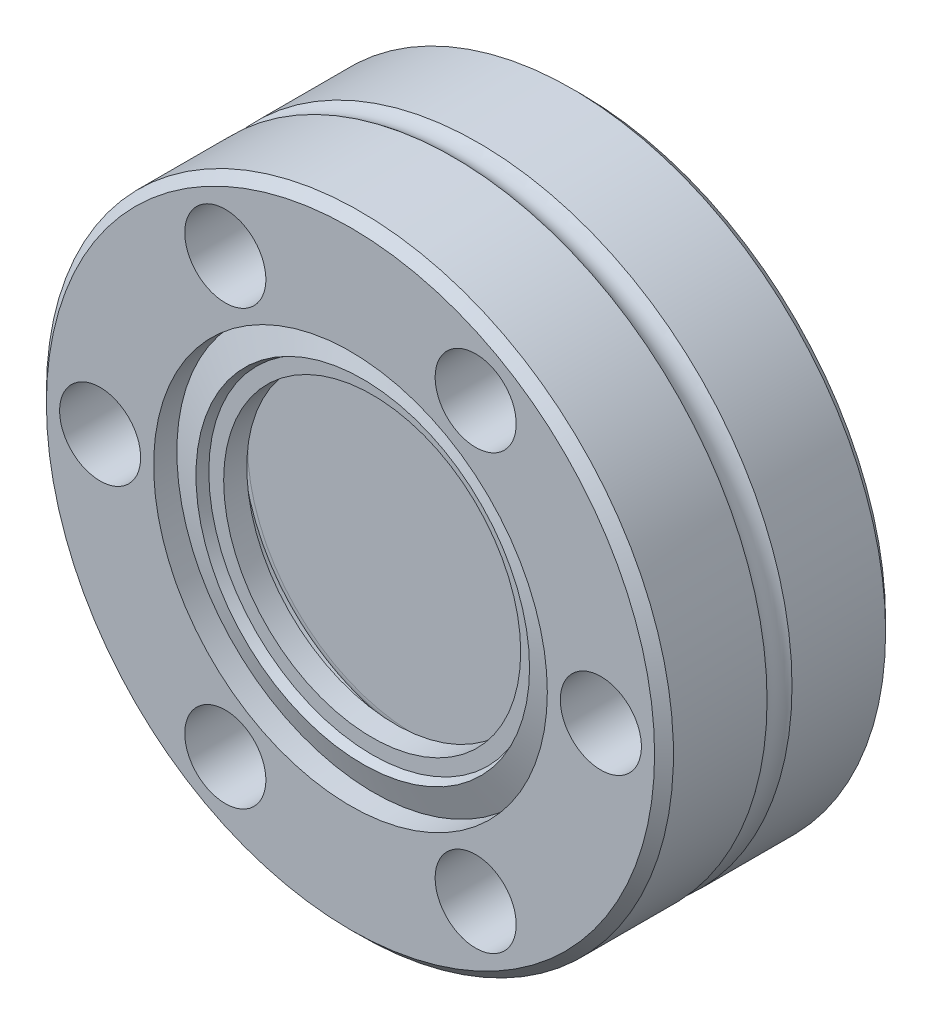
ISO-10303-21;
HEADER;
FILE_DESCRIPTION(('STEP AP214'),'2;1');
FILE_NAME('part.step','',(''),(''),'','','');
FILE_SCHEMA(('AUTOMOTIVE_DESIGN { 1 0 10303 214 1 1 1 1 }'));
ENDSEC;
DATA;
#1=APPLICATION_CONTEXT('core data for automotive mechanical design processes');
#2=APPLICATION_PROTOCOL_DEFINITION('international standard','automotive_design',2000,#1);
#3=PRODUCT_CONTEXT('',#1,'mechanical');
#4=PRODUCT('Part','Part','',(#3));
#5=PRODUCT_RELATED_PRODUCT_CATEGORY('part','',(#4));
#6=PRODUCT_DEFINITION_FORMATION('','',#4);
#7=PRODUCT_DEFINITION_CONTEXT('part definition',#1,'design');
#8=PRODUCT_DEFINITION('design','',#6,#7);
#9=PRODUCT_DEFINITION_SHAPE('','',#8);
#10=(LENGTH_UNIT() NAMED_UNIT(*) SI_UNIT(.MILLI.,.METRE.));
#11=(NAMED_UNIT(*) PLANE_ANGLE_UNIT() SI_UNIT($,.RADIAN.));
#12=(NAMED_UNIT(*) SI_UNIT($,.STERADIAN.) SOLID_ANGLE_UNIT());
#13=UNCERTAINTY_MEASURE_WITH_UNIT(LENGTH_MEASURE(1.E-05),#10,'distance_accuracy_value','');
#14=(GEOMETRIC_REPRESENTATION_CONTEXT(3) GLOBAL_UNCERTAINTY_ASSIGNED_CONTEXT((#13)) GLOBAL_UNIT_ASSIGNED_CONTEXT((#10,
#11,#12)) REPRESENTATION_CONTEXT('',''));
#15=CARTESIAN_POINT('',(0.,0.,0.));
#16=DIRECTION('',(0.,0.,1.));
#17=DIRECTION('',(1.,0.,0.));
#18=AXIS2_PLACEMENT_3D('',#15,#16,#17);
#19=CARTESIAN_POINT('',(0.,0.,8.3058));
#20=DIRECTION('',(0.,0.,-1.));
#21=DIRECTION('',(-1.,0.,0.));
#22=AXIS2_PLACEMENT_3D('',#19,#20,#21);
#23=TOROIDAL_SURFACE('',#22,9.0551,0.635);
#24=CARTESIAN_POINT('',(0.,0.,8.3058));
#25=DIRECTION('',(0.,0.,1.));
#26=DIRECTION('',(1.,0.,0.));
#27=AXIS2_PLACEMENT_3D('',#24,#25,#26);
#28=CIRCLE('',#27,9.6901);
#29=CARTESIAN_POINT('',(9.6901,0.,8.3058));
#30=VERTEX_POINT('',#29);
#31=EDGE_CURVE('E301',#30,#30,#28,.T.);
#32=ORIENTED_EDGE('',*,*,#31,.T.);
#33=EDGE_LOOP('',(#32));
#34=FACE_BOUND('',#33,.T.);
#35=CARTESIAN_POINT('',(0.,0.,8.9408));
#36=DIRECTION('',(0.,0.,-1.));
#37=DIRECTION('',(-1.,0.,0.));
#38=AXIS2_PLACEMENT_3D('',#35,#36,#37);
#39=CIRCLE('',#38,9.0551);
#40=CARTESIAN_POINT('',(-9.0551,0.,8.9408));
#41=VERTEX_POINT('',#40);
#42=EDGE_CURVE('E10',#41,#41,#39,.T.);
#43=ORIENTED_EDGE('',*,*,#42,.T.);
#44=EDGE_LOOP('',(#43));
#45=FACE_BOUND('',#44,.T.);
#46=ADVANCED_FACE('F16',(#34,#45),#23,.T.);
#47=CARTESIAN_POINT('',(-9.0551,0.,8.9408));
#48=DIRECTION('',(0.,0.,-1.));
#49=DIRECTION('',(0.,-1.,0.));
#50=AXIS2_PLACEMENT_3D('',#47,#48,#49);
#51=PLANE('',#50);
#52=ORIENTED_EDGE('',*,*,#42,.F.);
#53=EDGE_LOOP('',(#52));
#54=FACE_BOUND('',#53,.T.);
#55=ADVANCED_FACE('F360',(#54),#51,.F.);
#56=CARTESIAN_POINT('',(0.,0.,54.9906));
#57=DIRECTION('',(0.,0.,1.));
#58=DIRECTION('',(-1.,0.,0.));
#59=AXIS2_PLACEMENT_3D('',#56,#57,#58);
#60=CYLINDRICAL_SURFACE('',#59,9.1313);
#61=CARTESIAN_POINT('',(0.,0.,8.4328));
#62=DIRECTION('',(0.,0.,-1.));
#63=DIRECTION('',(-1.,0.,0.));
#64=AXIS2_PLACEMENT_3D('',#61,#62,#63);
#65=CIRCLE('',#64,9.1313);
#66=CARTESIAN_POINT('',(-9.1313,0.,8.4328));
#67=VERTEX_POINT('',#66);
#68=EDGE_CURVE('E24',#67,#67,#65,.T.);
#69=ORIENTED_EDGE('',*,*,#68,.F.);
#70=EDGE_LOOP('',(#69));
#71=FACE_BOUND('',#70,.T.);
#72=CARTESIAN_POINT('',(0.,0.,0.9906));
#73=DIRECTION('',(0.,0.,-1.));
#74=DIRECTION('',(-1.,0.,0.));
#75=AXIS2_PLACEMENT_3D('',#72,#73,#74);
#76=CIRCLE('',#75,9.1313);
#77=CARTESIAN_POINT('',(-9.1313,0.,0.9906));
#78=VERTEX_POINT('',#77);
#79=EDGE_CURVE('E237',#78,#78,#76,.T.);
#80=ORIENTED_EDGE('',*,*,#79,.T.);
#81=EDGE_LOOP('',(#80));
#82=FACE_BOUND('',#81,.T.);
#83=ADVANCED_FACE('F365',(#71,#82),#60,.F.);
#84=CARTESIAN_POINT('',(-8.39011573823687,0.,8.4328));
#85=DIRECTION('',(0.,0.,1.));
#86=DIRECTION('',(1.,0.,0.));
#87=AXIS2_PLACEMENT_3D('',#84,#85,#86);
#88=PLANE('',#87);
#89=ORIENTED_EDGE('',*,*,#68,.T.);
#90=EDGE_LOOP('',(#89));
#91=FACE_BOUND('',#90,.T.);
#92=ADVANCED_FACE('F384',(#91),#88,.F.);
#93=CARTESIAN_POINT('',(0.,0.,0.9906));
#94=DIRECTION('',(0.,0.,1.));
#95=DIRECTION('',(1.,0.,0.));
#96=AXIS2_PLACEMENT_3D('',#93,#94,#95);
#97=PLANE('',#96);
#98=ORIENTED_EDGE('',*,*,#79,.F.);
#99=EDGE_LOOP('',(#98));
#100=FACE_BOUND('',#99,.T.);
#101=CARTESIAN_POINT('',(0.,0.,0.9906));
#102=DIRECTION('',(0.,0.,1.));
#103=DIRECTION('',(0.,1.,0.));
#104=AXIS2_PLACEMENT_3D('',#101,#102,#103);
#105=CIRCLE('',#104,10.8077);
#106=CARTESIAN_POINT('',(0.,10.8077,0.9906));
#107=VERTEX_POINT('',#106);
#108=EDGE_CURVE('E209',#107,#107,#105,.T.);
#109=ORIENTED_EDGE('',*,*,#108,.F.);
#110=EDGE_LOOP('',(#109));
#111=FACE_BOUND('',#110,.T.);
#112=ADVANCED_FACE('F330',(#100,#111),#97,.F.);
#113=CARTESIAN_POINT('',(0.,0.,0.));
#114=DIRECTION('',(0.,0.,1.));
#115=DIRECTION('',(1.,0.,0.));
#116=AXIS2_PLACEMENT_3D('',#113,#114,#115);
#117=PLANE('',#116);
#118=CARTESIAN_POINT('',(0.,0.,0.));
#119=DIRECTION('',(0.,0.,1.));
#120=DIRECTION('',(1.,0.,0.));
#121=AXIS2_PLACEMENT_3D('',#118,#119,#120);
#122=CIRCLE('',#121,16.383);
#123=CARTESIAN_POINT('',(16.383,0.,0.));
#124=VERTEX_POINT('',#123);
#125=EDGE_CURVE('E234',#124,#124,#122,.T.);
#126=ORIENTED_EDGE('',*,*,#125,.F.);
#127=EDGE_LOOP('',(#126));
#128=FACE_BOUND('',#127,.T.);
#129=CARTESIAN_POINT('',(6.7437,11.6804310310022,0.));
#130=DIRECTION('',(0.,0.,-1.));
#131=DIRECTION('',(0.5,0.866025403784439,0.));
#132=AXIS2_PLACEMENT_3D('',#129,#130,#131);
#133=CIRCLE('',#132,2.1844);
#134=CARTESIAN_POINT('',(7.8359,13.5721769230289,0.));
#135=VERTEX_POINT('',#134);
#136=EDGE_CURVE('E223',#135,#135,#133,.T.);
#137=ORIENTED_EDGE('',*,*,#136,.F.);
#138=EDGE_LOOP('',(#137));
#139=FACE_BOUND('',#138,.T.);
#140=CARTESIAN_POINT('',(-6.7437,11.6804310310022,0.));
#141=DIRECTION('',(0.,0.,-1.));
#142=DIRECTION('',(-0.5,0.866025403784439,0.));
#143=AXIS2_PLACEMENT_3D('',#140,#141,#142);
#144=CIRCLE('',#143,2.1844);
#145=CARTESIAN_POINT('',(-7.8359,13.5721769230289,0.));
#146=VERTEX_POINT('',#145);
#147=EDGE_CURVE('E212',#146,#146,#144,.T.);
#148=ORIENTED_EDGE('',*,*,#147,.F.);
#149=EDGE_LOOP('',(#148));
#150=FACE_BOUND('',#149,.T.);
#151=CARTESIAN_POINT('',(-13.4874,0.,0.));
#152=DIRECTION('',(0.,0.,-1.));
#153=DIRECTION('',(-1.,0.,0.));
#154=AXIS2_PLACEMENT_3D('',#151,#152,#153);
#155=CIRCLE('',#154,2.1844);
#156=CARTESIAN_POINT('',(-15.6718,0.,0.));
#157=VERTEX_POINT('',#156);
#158=EDGE_CURVE('E185',#157,#157,#155,.T.);
#159=ORIENTED_EDGE('',*,*,#158,.F.);
#160=EDGE_LOOP('',(#159));
#161=FACE_BOUND('',#160,.T.);
#162=CARTESIAN_POINT('',(-6.7437,-11.6804310310022,0.));
#163=DIRECTION('',(0.,0.,-1.));
#164=DIRECTION('',(-0.5,-0.866025403784439,0.));
#165=AXIS2_PLACEMENT_3D('',#162,#163,#164);
#166=CIRCLE('',#165,2.1844);
#167=CARTESIAN_POINT('',(-7.8359,-13.5721769230289,0.));
#168=VERTEX_POINT('',#167);
#169=EDGE_CURVE('E184',#168,#168,#166,.T.);
#170=ORIENTED_EDGE('',*,*,#169,.F.);
#171=EDGE_LOOP('',(#170));
#172=FACE_BOUND('',#171,.T.);
#173=CARTESIAN_POINT('',(6.7437,-11.6804310310022,0.));
#174=DIRECTION('',(0.,0.,-1.));
#175=DIRECTION('',(0.5,-0.866025403784439,0.));
#176=AXIS2_PLACEMENT_3D('',#173,#174,#175);
#177=CIRCLE('',#176,2.1844);
#178=CARTESIAN_POINT('',(7.8359,-13.5721769230289,0.));
#179=VERTEX_POINT('',#178);
#180=EDGE_CURVE('E163',#179,#179,#177,.T.);
#181=ORIENTED_EDGE('',*,*,#180,.F.);
#182=EDGE_LOOP('',(#181));
#183=FACE_BOUND('',#182,.T.);
#184=CARTESIAN_POINT('',(13.4874,0.,0.));
#185=DIRECTION('',(0.,0.,-1.));
#186=DIRECTION('',(1.,0.,0.));
#187=AXIS2_PLACEMENT_3D('',#184,#185,#186);
#188=CIRCLE('',#187,2.1844);
#189=CARTESIAN_POINT('',(15.6718,0.,0.));
#190=VERTEX_POINT('',#189);
#191=EDGE_CURVE('E162',#190,#190,#188,.T.);
#192=ORIENTED_EDGE('',*,*,#191,.F.);
#193=EDGE_LOOP('',(#192));
#194=FACE_BOUND('',#193,.T.);
#195=CARTESIAN_POINT('',(0.,0.,0.));
#196=DIRECTION('',(0.,0.,1.));
#197=DIRECTION('',(0.,1.,0.));
#198=AXIS2_PLACEMENT_3D('',#195,#196,#197);
#199=CIRCLE('',#198,10.8077);
#200=CARTESIAN_POINT('',(0.,10.8077,0.));
#201=VERTEX_POINT('',#200);
#202=EDGE_CURVE('E213',#201,#201,#199,.T.);
#203=ORIENTED_EDGE('',*,*,#202,.T.);
#204=EDGE_LOOP('',(#203));
#205=FACE_BOUND('',#204,.T.);
#206=ADVANCED_FACE('F326',(#128,#139,#150,#161,#172,#183,#194,#205),#117,.F.);
#207=CARTESIAN_POINT('',(0.,0.,0.508000000000008));
#208=DIRECTION('',(0.,0.,1.));
#209=DIRECTION('',(1.,0.,0.));
#210=AXIS2_PLACEMENT_3D('',#207,#208,#209);
#211=CONICAL_SURFACE('',#210,16.891,0.785398163397442);
#212=ORIENTED_EDGE('',*,*,#125,.T.);
#213=EDGE_LOOP('',(#212));
#214=FACE_BOUND('',#213,.T.);
#215=CARTESIAN_POINT('',(0.,0.,0.508000000000008));
#216=DIRECTION('',(0.,0.,1.));
#217=DIRECTION('',(1.,0.,0.));
#218=AXIS2_PLACEMENT_3D('',#215,#216,#217);
#219=CIRCLE('',#218,16.891);
#220=CARTESIAN_POINT('',(16.891,0.,0.508000000000008));
#221=VERTEX_POINT('',#220);
#222=EDGE_CURVE('E180',#221,#221,#219,.T.);
#223=ORIENTED_EDGE('',*,*,#222,.F.);
#224=EDGE_LOOP('',(#223));
#225=FACE_BOUND('',#224,.T.);
#226=ADVANCED_FACE('F329',(#214,#225),#211,.T.);
#227=CARTESIAN_POINT('',(0.,0.,12.446));
#228=DIRECTION('',(0.,0.,-1.));
#229=DIRECTION('',(-1.,0.,0.));
#230=AXIS2_PLACEMENT_3D('',#227,#228,#229);
#231=CONICAL_SURFACE('',#230,16.383,0.785398163397455);
#232=CARTESIAN_POINT('',(0.,0.,11.938));
#233=DIRECTION('',(0.,0.,-1.));
#234=DIRECTION('',(-1.,0.,0.));
#235=AXIS2_PLACEMENT_3D('',#232,#233,#234);
#236=CIRCLE('',#235,16.891);
#237=CARTESIAN_POINT('',(-16.891,0.,11.938));
#238=VERTEX_POINT('',#237);
#239=EDGE_CURVE('E198',#238,#238,#236,.T.);
#240=ORIENTED_EDGE('',*,*,#239,.F.);
#241=EDGE_LOOP('',(#240));
#242=FACE_BOUND('',#241,.T.);
#243=CARTESIAN_POINT('',(0.,0.,12.446));
#244=DIRECTION('',(0.,0.,-1.));
#245=DIRECTION('',(-1.,0.,0.));
#246=AXIS2_PLACEMENT_3D('',#243,#244,#245);
#247=CIRCLE('',#246,16.383);
#248=CARTESIAN_POINT('',(-16.383,0.,12.446));
#249=VERTEX_POINT('',#248);
#250=EDGE_CURVE('E181',#249,#249,#247,.T.);
#251=ORIENTED_EDGE('',*,*,#250,.T.);
#252=EDGE_LOOP('',(#251));
#253=FACE_BOUND('',#252,.T.);
#254=ADVANCED_FACE('F435',(#242,#253),#231,.T.);
#255=CARTESIAN_POINT('',(0.,0.,6.223));
#256=DIRECTION('',(0.,0.,1.));
#257=DIRECTION('',(1.,0.,0.));
#258=AXIS2_PLACEMENT_3D('',#255,#256,#257);
#259=TOROIDAL_SURFACE('',#258,17.653,1.016);
#260=CARTESIAN_POINT('',(0.,0.,6.89502083301041));
#261=DIRECTION('',(0.,0.,-1.));
#262=DIRECTION('',(-1.,0.,0.));
#263=AXIS2_PLACEMENT_3D('',#260,#261,#262);
#264=CIRCLE('',#263,16.891);
#265=CARTESIAN_POINT('',(-16.891,0.,6.89502083301041));
#266=VERTEX_POINT('',#265);
#267=EDGE_CURVE('E195',#266,#266,#264,.T.);
#268=ORIENTED_EDGE('',*,*,#267,.T.);
#269=EDGE_LOOP('',(#268));
#270=FACE_BOUND('',#269,.T.);
#271=CARTESIAN_POINT('',(0.,0.,5.55097916698959));
#272=DIRECTION('',(0.,0.,1.));
#273=DIRECTION('',(1.,0.,0.));
#274=AXIS2_PLACEMENT_3D('',#271,#272,#273);
#275=CIRCLE('',#274,16.891);
#276=CARTESIAN_POINT('',(16.891,0.,5.55097916698959));
#277=VERTEX_POINT('',#276);
#278=EDGE_CURVE('E177',#277,#277,#275,.T.);
#279=ORIENTED_EDGE('',*,*,#278,.T.);
#280=EDGE_LOOP('',(#279));
#281=FACE_BOUND('',#280,.T.);
#282=ADVANCED_FACE('F431',(#270,#281),#259,.F.);
#283=CARTESIAN_POINT('',(0.,0.,137.16));
#284=DIRECTION('',(0.,0.,-1.));
#285=DIRECTION('',(1.,0.,0.));
#286=AXIS2_PLACEMENT_3D('',#283,#284,#285);
#287=CYLINDRICAL_SURFACE('',#286,16.891);
#288=ORIENTED_EDGE('',*,*,#222,.T.);
#289=EDGE_LOOP('',(#288));
#290=FACE_BOUND('',#289,.T.);
#291=ORIENTED_EDGE('',*,*,#278,.F.);
#292=EDGE_LOOP('',(#291));
#293=FACE_BOUND('',#292,.T.);
#294=ADVANCED_FACE('F396',(#290,#293),#287,.T.);
#295=CARTESIAN_POINT('',(16.891,0.,12.446));
#296=DIRECTION('',(0.,0.,-1.));
#297=DIRECTION('',(0.,-1.,0.));
#298=AXIS2_PLACEMENT_3D('',#295,#296,#297);
#299=PLANE('',#298);
#300=ORIENTED_EDGE('',*,*,#250,.F.);
#301=EDGE_LOOP('',(#300));
#302=FACE_BOUND('',#301,.T.);
#303=CARTESIAN_POINT('',(6.7437,11.6804310310022,12.446));
#304=DIRECTION('',(0.,0.,-1.));
#305=DIRECTION('',(-1.,0.,0.));
#306=AXIS2_PLACEMENT_3D('',#303,#304,#305);
#307=CIRCLE('',#306,2.1844);
#308=CARTESIAN_POINT('',(4.5593,11.6804310310022,12.446));
#309=VERTEX_POINT('',#308);
#310=EDGE_CURVE('E199',#309,#309,#307,.T.);
#311=ORIENTED_EDGE('',*,*,#310,.T.);
#312=EDGE_LOOP('',(#311));
#313=FACE_BOUND('',#312,.T.);
#314=CARTESIAN_POINT('',(-6.7437,11.6804310310022,12.446));
#315=DIRECTION('',(0.,0.,-1.));
#316=DIRECTION('',(-1.,0.,0.));
#317=AXIS2_PLACEMENT_3D('',#314,#315,#316);
#318=CIRCLE('',#317,2.1844);
#319=CARTESIAN_POINT('',(-8.9281,11.6804310310022,12.446));
#320=VERTEX_POINT('',#319);
#321=EDGE_CURVE('E220',#320,#320,#318,.T.);
#322=ORIENTED_EDGE('',*,*,#321,.T.);
#323=EDGE_LOOP('',(#322));
#324=FACE_BOUND('',#323,.T.);
#325=CARTESIAN_POINT('',(-13.4874,0.,12.446));
#326=DIRECTION('',(0.,0.,-1.));
#327=DIRECTION('',(-1.,0.,0.));
#328=AXIS2_PLACEMENT_3D('',#325,#326,#327);
#329=CIRCLE('',#328,2.1844);
#330=CARTESIAN_POINT('',(-15.6718,0.,12.446));
#331=VERTEX_POINT('',#330);
#332=EDGE_CURVE('E188',#331,#331,#329,.T.);
#333=ORIENTED_EDGE('',*,*,#332,.T.);
#334=EDGE_LOOP('',(#333));
#335=FACE_BOUND('',#334,.T.);
#336=CARTESIAN_POINT('',(-6.7437,-11.6804310310022,12.446));
#337=DIRECTION('',(0.,0.,-1.));
#338=DIRECTION('',(-1.,0.,0.));
#339=AXIS2_PLACEMENT_3D('',#336,#337,#338);
#340=CIRCLE('',#339,2.1844);
#341=CARTESIAN_POINT('',(-8.9281,-11.6804310310022,12.446));
#342=VERTEX_POINT('',#341);
#343=EDGE_CURVE('E171',#342,#342,#340,.T.);
#344=ORIENTED_EDGE('',*,*,#343,.T.);
#345=EDGE_LOOP('',(#344));
#346=FACE_BOUND('',#345,.T.);
#347=CARTESIAN_POINT('',(6.7437,-11.6804310310022,12.446));
#348=DIRECTION('',(0.,0.,-1.));
#349=DIRECTION('',(-1.,0.,0.));
#350=AXIS2_PLACEMENT_3D('',#347,#348,#349);
#351=CIRCLE('',#350,2.1844);
#352=CARTESIAN_POINT('',(4.5593,-11.6804310310022,12.446));
#353=VERTEX_POINT('',#352);
#354=EDGE_CURVE('E157',#353,#353,#351,.T.);
#355=ORIENTED_EDGE('',*,*,#354,.T.);
#356=EDGE_LOOP('',(#355));
#357=FACE_BOUND('',#356,.T.);
#358=CARTESIAN_POINT('',(13.4874,0.,12.446));
#359=DIRECTION('',(0.,0.,-1.));
#360=DIRECTION('',(-1.,0.,0.));
#361=AXIS2_PLACEMENT_3D('',#358,#359,#360);
#362=CIRCLE('',#361,2.1844);
#363=CARTESIAN_POINT('',(11.303,0.,12.446));
#364=VERTEX_POINT('',#363);
#365=EDGE_CURVE('E169',#364,#364,#362,.T.);
#366=ORIENTED_EDGE('',*,*,#365,.T.);
#367=EDGE_LOOP('',(#366));
#368=FACE_BOUND('',#367,.T.);
#369=CARTESIAN_POINT('',(0.,0.,12.446));
#370=DIRECTION('',(0.,0.,1.));
#371=DIRECTION('',(1.,0.,0.));
#372=AXIS2_PLACEMENT_3D('',#369,#370,#371);
#373=CIRCLE('',#372,10.6045);
#374=CARTESIAN_POINT('',(10.6045,0.,12.446));
#375=VERTEX_POINT('',#374);
#376=EDGE_CURVE('E206',#375,#375,#373,.T.);
#377=ORIENTED_EDGE('',*,*,#376,.F.);
#378=EDGE_LOOP('',(#377));
#379=FACE_BOUND('',#378,.T.);
#380=ADVANCED_FACE('F158',(#302,#313,#324,#335,#346,#357,#368,#379),#299,.F.);
#381=CARTESIAN_POINT('',(0.,0.,137.16));
#382=DIRECTION('',(0.,0.,-1.));
#383=DIRECTION('',(1.,0.,0.));
#384=AXIS2_PLACEMENT_3D('',#381,#382,#383);
#385=CYLINDRICAL_SURFACE('',#384,16.891);
#386=ORIENTED_EDGE('',*,*,#239,.T.);
#387=EDGE_LOOP('',(#386));
#388=FACE_BOUND('',#387,.T.);
#389=ORIENTED_EDGE('',*,*,#267,.F.);
#390=EDGE_LOOP('',(#389));
#391=FACE_BOUND('',#390,.T.);
#392=ADVANCED_FACE('F378',(#388,#391),#385,.T.);
#393=CARTESIAN_POINT('',(6.7437,11.6804310310022,49.3695246483092));
#394=DIRECTION('',(0.,0.,1.));
#395=DIRECTION('',(-1.,0.,0.));
#396=AXIS2_PLACEMENT_3D('',#393,#394,#395);
#397=CYLINDRICAL_SURFACE('',#396,2.1844);
#398=ORIENTED_EDGE('',*,*,#310,.F.);
#399=EDGE_LOOP('',(#398));
#400=FACE_BOUND('',#399,.T.);
#401=ORIENTED_EDGE('',*,*,#136,.T.);
#402=EDGE_LOOP('',(#401));
#403=FACE_BOUND('',#402,.T.);
#404=ADVANCED_FACE('F381',(#400,#403),#397,.F.);
#405=CARTESIAN_POINT('',(-6.7437,11.6804310310022,49.3695246483092));
#406=DIRECTION('',(0.,0.,1.));
#407=DIRECTION('',(-1.,0.,0.));
#408=AXIS2_PLACEMENT_3D('',#405,#406,#407);
#409=CYLINDRICAL_SURFACE('',#408,2.1844);
#410=ORIENTED_EDGE('',*,*,#321,.F.);
#411=EDGE_LOOP('',(#410));
#412=FACE_BOUND('',#411,.T.);
#413=ORIENTED_EDGE('',*,*,#147,.T.);
#414=EDGE_LOOP('',(#413));
#415=FACE_BOUND('',#414,.T.);
#416=ADVANCED_FACE('F355',(#412,#415),#409,.F.);
#417=CARTESIAN_POINT('',(8.8011,0.,11.2776));
#418=DIRECTION('',(0.,0.,-1.));
#419=DIRECTION('',(0.,-1.,0.));
#420=AXIS2_PLACEMENT_3D('',#417,#418,#419);
#421=PLANE('',#420);
#422=CARTESIAN_POINT('',(0.,0.,11.2776));
#423=DIRECTION('',(0.,0.,1.));
#424=DIRECTION('',(1.,0.,0.));
#425=AXIS2_PLACEMENT_3D('',#422,#423,#424);
#426=CIRCLE('',#425,8.8011);
#427=CARTESIAN_POINT('',(8.8011,0.,11.2776));
#428=VERTEX_POINT('',#427);
#429=EDGE_CURVE('E202',#428,#428,#426,.T.);
#430=ORIENTED_EDGE('',*,*,#429,.T.);
#431=EDGE_LOOP('',(#430));
#432=FACE_BOUND('',#431,.T.);
#433=CARTESIAN_POINT('',(0.,0.,11.2776));
#434=DIRECTION('',(0.,0.,-1.));
#435=DIRECTION('',(-1.,0.,0.));
#436=AXIS2_PLACEMENT_3D('',#433,#434,#435);
#437=CIRCLE('',#436,8.001);
#438=CARTESIAN_POINT('',(-8.001,0.,11.2776));
#439=VERTEX_POINT('',#438);
#440=EDGE_CURVE('E175',#439,#439,#437,.T.);
#441=ORIENTED_EDGE('',*,*,#440,.T.);
#442=EDGE_LOOP('',(#441));
#443=FACE_BOUND('',#442,.T.);
#444=ADVANCED_FACE('F344',(#432,#443),#421,.F.);
#445=CARTESIAN_POINT('',(0.,0.,0.9906));
#446=DIRECTION('',(0.,0.,1.));
#447=DIRECTION('',(-1.,0.,0.));
#448=AXIS2_PLACEMENT_3D('',#445,#446,#447);
#449=CYLINDRICAL_SURFACE('',#448,10.8077);
#450=ORIENTED_EDGE('',*,*,#108,.T.);
#451=EDGE_LOOP('',(#450));
#452=FACE_BOUND('',#451,.T.);
#453=ORIENTED_EDGE('',*,*,#202,.F.);
#454=EDGE_LOOP('',(#453));
#455=FACE_BOUND('',#454,.T.);
#456=ADVANCED_FACE('F341',(#452,#455),#449,.F.);
#457=CARTESIAN_POINT('',(0.,0.,-38.091924648309));
#458=DIRECTION('',(0.,0.,-1.));
#459=DIRECTION('',(1.,0.,0.));
#460=AXIS2_PLACEMENT_3D('',#457,#458,#459);
#461=CYLINDRICAL_SURFACE('',#460,8.001);
#462=CARTESIAN_POINT('',(0.,0.,10.033));
#463=DIRECTION('',(0.,0.,1.));
#464=DIRECTION('',(1.,0.,0.));
#465=AXIS2_PLACEMENT_3D('',#462,#463,#464);
#466=CIRCLE('',#465,8.001);
#467=CARTESIAN_POINT('',(8.001,0.,10.033));
#468=VERTEX_POINT('',#467);
#469=EDGE_CURVE('E189',#468,#468,#466,.T.);
#470=ORIENTED_EDGE('',*,*,#469,.F.);
#471=EDGE_LOOP('',(#470));
#472=FACE_BOUND('',#471,.T.);
#473=ORIENTED_EDGE('',*,*,#440,.F.);
#474=EDGE_LOOP('',(#473));
#475=FACE_BOUND('',#474,.T.);
#476=ADVANCED_FACE('F343',(#472,#475),#461,.F.);
#477=CARTESIAN_POINT('',(0.,0.,137.16));
#478=DIRECTION('',(0.,0.,-1.));
#479=DIRECTION('',(1.,0.,0.));
#480=AXIS2_PLACEMENT_3D('',#477,#478,#479);
#481=CYLINDRICAL_SURFACE('',#480,10.6045);
#482=CARTESIAN_POINT('',(0.,0.,11.1965130398917));
#483=DIRECTION('',(0.,0.,1.));
#484=DIRECTION('',(1.,0.,0.));
#485=AXIS2_PLACEMENT_3D('',#482,#483,#484);
#486=CIRCLE('',#485,10.6045);
#487=CARTESIAN_POINT('',(10.6045,0.,11.1965130398917));
#488=VERTEX_POINT('',#487);
#489=EDGE_CURVE('E203',#488,#488,#486,.T.);
#490=ORIENTED_EDGE('',*,*,#489,.F.);
#491=EDGE_LOOP('',(#490));
#492=FACE_BOUND('',#491,.T.);
#493=ORIENTED_EDGE('',*,*,#376,.T.);
#494=EDGE_LOOP('',(#493));
#495=FACE_BOUND('',#494,.T.);
#496=ADVANCED_FACE('F352',(#492,#495),#481,.F.);
#497=CARTESIAN_POINT('',(0.,0.,11.1965130398917));
#498=DIRECTION('',(0.,0.,-1.));
#499=DIRECTION('',(-1.,0.,0.));
#500=AXIS2_PLACEMENT_3D('',#497,#498,#499);
#501=CONICAL_SURFACE('',#500,10.6045,1.22173047639603);
#502=CARTESIAN_POINT('',(0.,0.,11.7856));
#503=DIRECTION('',(0.,0.,1.));
#504=DIRECTION('',(1.,0.,0.));
#505=AXIS2_PLACEMENT_3D('',#502,#503,#504);
#506=CIRCLE('',#505,8.98599687900723);
#507=CARTESIAN_POINT('',(8.98599687900723,0.,11.7856));
#508=VERTEX_POINT('',#507);
#509=EDGE_CURVE('E194',#508,#508,#506,.T.);
#510=ORIENTED_EDGE('',*,*,#509,.F.);
#511=EDGE_LOOP('',(#510));
#512=FACE_BOUND('',#511,.T.);
#513=ORIENTED_EDGE('',*,*,#489,.T.);
#514=EDGE_LOOP('',(#513));
#515=FACE_BOUND('',#514,.T.);
#516=ADVANCED_FACE('F406',(#512,#515),#501,.T.);
#517=CARTESIAN_POINT('',(0.,0.,11.7856));
#518=DIRECTION('',(0.,0.,1.));
#519=DIRECTION('',(1.,0.,0.));
#520=AXIS2_PLACEMENT_3D('',#517,#518,#519);
#521=CONICAL_SURFACE('',#520,8.98599687900723,0.34906585039886);
#522=ORIENTED_EDGE('',*,*,#429,.F.);
#523=EDGE_LOOP('',(#522));
#524=FACE_BOUND('',#523,.T.);
#525=ORIENTED_EDGE('',*,*,#509,.T.);
#526=EDGE_LOOP('',(#525));
#527=FACE_BOUND('',#526,.T.);
#528=ADVANCED_FACE('F403',(#524,#527),#521,.F.);
#529=CARTESIAN_POINT('',(13.4874,0.,49.3695246483092));
#530=DIRECTION('',(0.,0.,1.));
#531=DIRECTION('',(-1.,0.,0.));
#532=AXIS2_PLACEMENT_3D('',#529,#530,#531);
#533=CYLINDRICAL_SURFACE('',#532,2.1844);
#534=ORIENTED_EDGE('',*,*,#365,.F.);
#535=EDGE_LOOP('',(#534));
#536=FACE_BOUND('',#535,.T.);
#537=ORIENTED_EDGE('',*,*,#191,.T.);
#538=EDGE_LOOP('',(#537));
#539=FACE_BOUND('',#538,.T.);
#540=ADVANCED_FACE('F400',(#536,#539),#533,.F.);
#541=CARTESIAN_POINT('',(6.7437,-11.6804310310022,49.3695246483092));
#542=DIRECTION('',(0.,0.,1.));
#543=DIRECTION('',(-1.,0.,0.));
#544=AXIS2_PLACEMENT_3D('',#541,#542,#543);
#545=CYLINDRICAL_SURFACE('',#544,2.1844);
#546=ORIENTED_EDGE('',*,*,#354,.F.);
#547=EDGE_LOOP('',(#546));
#548=FACE_BOUND('',#547,.T.);
#549=ORIENTED_EDGE('',*,*,#180,.T.);
#550=EDGE_LOOP('',(#549));
#551=FACE_BOUND('',#550,.T.);
#552=ADVANCED_FACE('F392',(#548,#551),#545,.F.);
#553=CARTESIAN_POINT('',(-6.7437,-11.6804310310022,49.3695246483092));
#554=DIRECTION('',(0.,0.,1.));
#555=DIRECTION('',(-1.,0.,0.));
#556=AXIS2_PLACEMENT_3D('',#553,#554,#555);
#557=CYLINDRICAL_SURFACE('',#556,2.1844);
#558=ORIENTED_EDGE('',*,*,#343,.F.);
#559=EDGE_LOOP('',(#558));
#560=FACE_BOUND('',#559,.T.);
#561=ORIENTED_EDGE('',*,*,#169,.T.);
#562=EDGE_LOOP('',(#561));
#563=FACE_BOUND('',#562,.T.);
#564=ADVANCED_FACE('F322',(#560,#563),#557,.F.);
#565=CARTESIAN_POINT('',(-13.4874,0.,49.3695246483092));
#566=DIRECTION('',(0.,0.,1.));
#567=DIRECTION('',(-1.,0.,0.));
#568=AXIS2_PLACEMENT_3D('',#565,#566,#567);
#569=CYLINDRICAL_SURFACE('',#568,2.1844);
#570=ORIENTED_EDGE('',*,*,#332,.F.);
#571=EDGE_LOOP('',(#570));
#572=FACE_BOUND('',#571,.T.);
#573=ORIENTED_EDGE('',*,*,#158,.T.);
#574=EDGE_LOOP('',(#573));
#575=FACE_BOUND('',#574,.T.);
#576=ADVANCED_FACE('F318',(#572,#575),#569,.F.);
#577=CARTESIAN_POINT('',(0.,0.,10.033));
#578=DIRECTION('',(0.,0.,1.));
#579=DIRECTION('',(1.,0.,0.));
#580=AXIS2_PLACEMENT_3D('',#577,#578,#579);
#581=PLANE('',#580);
#582=ORIENTED_EDGE('',*,*,#469,.T.);
#583=EDGE_LOOP('',(#582));
#584=FACE_BOUND('',#583,.T.);
#585=CARTESIAN_POINT('',(0.,0.,10.033));
#586=DIRECTION('',(0.,0.,1.));
#587=DIRECTION('',(0.,1.,0.));
#588=AXIS2_PLACEMENT_3D('',#585,#586,#587);
#589=CIRCLE('',#588,9.6901);
#590=CARTESIAN_POINT('',(0.,9.6901,10.033));
#591=VERTEX_POINT('',#590);
#592=EDGE_CURVE('E306',#591,#591,#589,.T.);
#593=ORIENTED_EDGE('',*,*,#592,.F.);
#594=EDGE_LOOP('',(#593));
#595=FACE_BOUND('',#594,.T.);
#596=ADVANCED_FACE('F321',(#584,#595),#581,.F.);
#597=CARTESIAN_POINT('',(0.,0.,10.033));
#598=DIRECTION('',(0.,0.,1.));
#599=DIRECTION('',(-1.,0.,0.));
#600=AXIS2_PLACEMENT_3D('',#597,#598,#599);
#601=CYLINDRICAL_SURFACE('',#600,9.6901);
#602=ORIENTED_EDGE('',*,*,#31,.F.);
#603=EDGE_LOOP('',(#602));
#604=FACE_BOUND('',#603,.T.);
#605=ORIENTED_EDGE('',*,*,#592,.T.);
#606=EDGE_LOOP('',(#605));
#607=FACE_BOUND('',#606,.T.);
#608=ADVANCED_FACE('F369',(#604,#607),#601,.F.);
#609=CLOSED_SHELL('',(#46,#55,#83,#92,#112,#206,#226,#254,#282,#294,#380,#392,#404,#416,#444,
#456,#476,#496,#516,#528,#540,#552,#564,#576,#596,#608));
#610=MANIFOLD_SOLID_BREP('B1',#609);
#611=ADVANCED_BREP_SHAPE_REPRESENTATION('',(#18,#610),#14);
#612=SHAPE_DEFINITION_REPRESENTATION(#9,#611);
ENDSEC;
END-ISO-10303-21;
